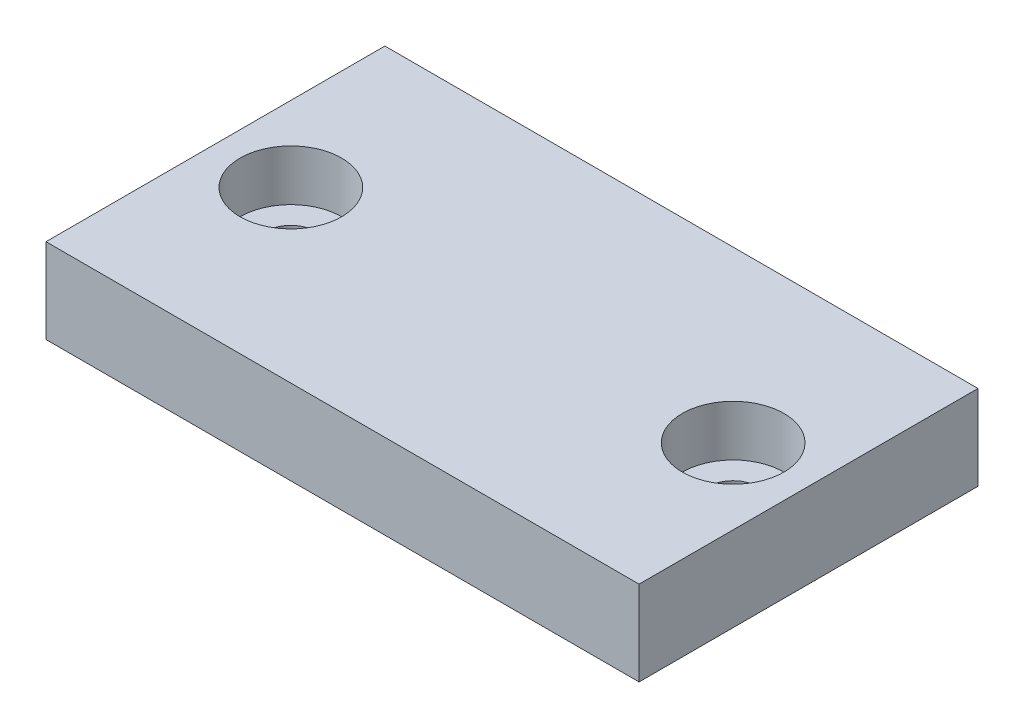
ISO-10303-21;
HEADER;
FILE_DESCRIPTION(('STEP AP214'),'2;1');
FILE_NAME('part.step','',(''),(''),'','','');
FILE_SCHEMA(('AUTOMOTIVE_DESIGN { 1 0 10303 214 1 1 1 1 }'));
ENDSEC;
DATA;
#1=APPLICATION_CONTEXT('core data for automotive mechanical design processes');
#2=APPLICATION_PROTOCOL_DEFINITION('international standard','automotive_design',2000,#1);
#3=PRODUCT_CONTEXT('',#1,'mechanical');
#4=PRODUCT('Part','Part','',(#3));
#5=PRODUCT_RELATED_PRODUCT_CATEGORY('part','',(#4));
#6=PRODUCT_DEFINITION_FORMATION('','',#4);
#7=PRODUCT_DEFINITION_CONTEXT('part definition',#1,'design');
#8=PRODUCT_DEFINITION('design','',#6,#7);
#9=PRODUCT_DEFINITION_SHAPE('','',#8);
#10=(LENGTH_UNIT() NAMED_UNIT(*) SI_UNIT(.MILLI.,.METRE.));
#11=(NAMED_UNIT(*) PLANE_ANGLE_UNIT() SI_UNIT($,.RADIAN.));
#12=(NAMED_UNIT(*) SI_UNIT($,.STERADIAN.) SOLID_ANGLE_UNIT());
#13=UNCERTAINTY_MEASURE_WITH_UNIT(LENGTH_MEASURE(1.E-05),#10,'distance_accuracy_value','');
#14=(GEOMETRIC_REPRESENTATION_CONTEXT(3) GLOBAL_UNCERTAINTY_ASSIGNED_CONTEXT((#13)) GLOBAL_UNIT_ASSIGNED_CONTEXT((#10,
#11,#12)) REPRESENTATION_CONTEXT('',''));
#15=CARTESIAN_POINT('',(0.,0.,0.));
#16=DIRECTION('',(0.,0.,1.));
#17=DIRECTION('',(1.,0.,0.));
#18=AXIS2_PLACEMENT_3D('',#15,#16,#17);
#19=CARTESIAN_POINT('',(-13.05,5.,0.));
#20=DIRECTION('',(0.,-1.,0.));
#21=DIRECTION('',(0.,0.,-1.));
#22=AXIS2_PLACEMENT_3D('',#19,#20,#21);
#23=CYLINDRICAL_SURFACE('',#22,1.5);
#24=CARTESIAN_POINT('',(-13.05,0.,0.));
#25=DIRECTION('',(0.,1.,0.));
#26=DIRECTION('',(0.,0.,1.));
#27=AXIS2_PLACEMENT_3D('',#24,#25,#26);
#28=CIRCLE('',#27,1.5);
#29=CARTESIAN_POINT('',(-13.05,0.,1.5));
#30=VERTEX_POINT('',#29);
#31=EDGE_CURVE('E103',#30,#30,#28,.T.);
#32=ORIENTED_EDGE('',*,*,#31,.F.);
#33=EDGE_LOOP('',(#32));
#34=FACE_BOUND('',#33,.T.);
#35=CARTESIAN_POINT('',(-13.05,2.,0.));
#36=DIRECTION('',(0.,1.,0.));
#37=DIRECTION('',(0.,0.,1.));
#38=AXIS2_PLACEMENT_3D('',#35,#36,#37);
#39=CIRCLE('',#38,1.5);
#40=CARTESIAN_POINT('',(-13.05,2.,1.5));
#41=VERTEX_POINT('',#40);
#42=EDGE_CURVE('E37',#41,#41,#39,.T.);
#43=ORIENTED_EDGE('',*,*,#42,.T.);
#44=EDGE_LOOP('',(#43));
#45=FACE_BOUND('',#44,.T.);
#46=ADVANCED_FACE('F33',(#34,#45),#23,.F.);
#47=CARTESIAN_POINT('',(13.05,5.,0.));
#48=DIRECTION('',(0.,-1.,0.));
#49=DIRECTION('',(0.,0.,-1.));
#50=AXIS2_PLACEMENT_3D('',#47,#48,#49);
#51=CYLINDRICAL_SURFACE('',#50,1.5);
#52=CARTESIAN_POINT('',(13.05,0.,0.));
#53=DIRECTION('',(0.,1.,0.));
#54=DIRECTION('',(0.,0.,1.));
#55=AXIS2_PLACEMENT_3D('',#52,#53,#54);
#56=CIRCLE('',#55,1.5);
#57=CARTESIAN_POINT('',(13.05,0.,1.49999999999999));
#58=VERTEX_POINT('',#57);
#59=EDGE_CURVE('E114',#58,#58,#56,.T.);
#60=ORIENTED_EDGE('',*,*,#59,.F.);
#61=EDGE_LOOP('',(#60));
#62=FACE_BOUND('',#61,.T.);
#63=CARTESIAN_POINT('',(13.05,2.,0.));
#64=DIRECTION('',(0.,1.,0.));
#65=DIRECTION('',(0.,0.,1.));
#66=AXIS2_PLACEMENT_3D('',#63,#64,#65);
#67=CIRCLE('',#66,1.5);
#68=CARTESIAN_POINT('',(13.05,2.,1.49999999999999));
#69=VERTEX_POINT('',#68);
#70=EDGE_CURVE('E108',#69,#69,#67,.T.);
#71=ORIENTED_EDGE('',*,*,#70,.T.);
#72=EDGE_LOOP('',(#71));
#73=FACE_BOUND('',#72,.T.);
#74=ADVANCED_FACE('F139',(#62,#73),#51,.F.);
#75=CARTESIAN_POINT('',(0.,5.,0.));
#76=DIRECTION('',(0.,1.,0.));
#77=DIRECTION('',(0.,0.,1.));
#78=AXIS2_PLACEMENT_3D('',#75,#76,#77);
#79=PLANE('',#78);
#80=CARTESIAN_POINT('',(-13.05,5.,0.));
#81=DIRECTION('',(0.,1.,0.));
#82=DIRECTION('',(0.,0.,1.));
#83=AXIS2_PLACEMENT_3D('',#80,#81,#82);
#84=CIRCLE('',#83,3.);
#85=CARTESIAN_POINT('',(-13.05,5.,3.));
#86=VERTEX_POINT('',#85);
#87=EDGE_CURVE('E116',#86,#86,#84,.T.);
#88=ORIENTED_EDGE('',*,*,#87,.F.);
#89=EDGE_LOOP('',(#88));
#90=FACE_BOUND('',#89,.T.);
#91=CARTESIAN_POINT('',(13.05,5.,0.));
#92=DIRECTION('',(0.,1.,0.));
#93=DIRECTION('',(0.,0.,1.));
#94=AXIS2_PLACEMENT_3D('',#91,#92,#93);
#95=CIRCLE('',#94,3.);
#96=CARTESIAN_POINT('',(13.05,5.,2.99999999999999));
#97=VERTEX_POINT('',#96);
#98=EDGE_CURVE('E126',#97,#97,#95,.T.);
#99=ORIENTED_EDGE('',*,*,#98,.F.);
#100=EDGE_LOOP('',(#99));
#101=FACE_BOUND('',#100,.T.);
#102=DIRECTION('',(0.,0.,1.));
#103=VECTOR('',#102,1.);
#104=CARTESIAN_POINT('',(-17.5,5.,10.));
#105=LINE('',#104,#103);
#106=CARTESIAN_POINT('',(-17.5,5.,-10.));
#107=VERTEX_POINT('',#106);
#108=CARTESIAN_POINT('',(-17.5,5.,10.));
#109=VERTEX_POINT('',#108);
#110=EDGE_CURVE('E87',#107,#109,#105,.T.);
#111=ORIENTED_EDGE('',*,*,#110,.T.);
#112=DIRECTION('',(1.,0.,0.));
#113=VECTOR('',#112,1.);
#114=CARTESIAN_POINT('',(17.5,5.,9.99999999999999));
#115=LINE('',#114,#113);
#116=CARTESIAN_POINT('',(17.5,5.,9.99999999999999));
#117=VERTEX_POINT('',#116);
#118=EDGE_CURVE('E82',#109,#117,#115,.T.);
#119=ORIENTED_EDGE('',*,*,#118,.T.);
#120=DIRECTION('',(0.,0.,-1.));
#121=VECTOR('',#120,1.);
#122=CARTESIAN_POINT('',(17.5,5.,9.99999999999999));
#123=LINE('',#122,#121);
#124=CARTESIAN_POINT('',(17.5,5.,-10.));
#125=VERTEX_POINT('',#124);
#126=EDGE_CURVE('E85',#117,#125,#123,.T.);
#127=ORIENTED_EDGE('',*,*,#126,.T.);
#128=DIRECTION('',(-1.,0.,0.));
#129=VECTOR('',#128,1.);
#130=CARTESIAN_POINT('',(17.5,5.,-10.));
#131=LINE('',#130,#129);
#132=EDGE_CURVE('E52',#125,#107,#131,.T.);
#133=ORIENTED_EDGE('',*,*,#132,.T.);
#134=EDGE_LOOP('',(#111,#119,#127,#133));
#135=FACE_BOUND('',#134,.T.);
#136=ADVANCED_FACE('F83',(#90,#101,#135),#79,.T.);
#137=CARTESIAN_POINT('',(0.,0.,0.));
#138=DIRECTION('',(0.,1.,0.));
#139=DIRECTION('',(0.,0.,1.));
#140=AXIS2_PLACEMENT_3D('',#137,#138,#139);
#141=PLANE('',#140);
#142=DIRECTION('',(0.,0.,1.));
#143=VECTOR('',#142,1.);
#144=CARTESIAN_POINT('',(-17.5,0.,10.));
#145=LINE('',#144,#143);
#146=CARTESIAN_POINT('',(-17.5,0.,-10.));
#147=VERTEX_POINT('',#146);
#148=CARTESIAN_POINT('',(-17.5,0.,10.));
#149=VERTEX_POINT('',#148);
#150=EDGE_CURVE('E100',#147,#149,#145,.T.);
#151=ORIENTED_EDGE('',*,*,#150,.F.);
#152=DIRECTION('',(-1.,0.,0.));
#153=VECTOR('',#152,1.);
#154=CARTESIAN_POINT('',(17.5,0.,-10.));
#155=LINE('',#154,#153);
#156=CARTESIAN_POINT('',(17.5,0.,-10.));
#157=VERTEX_POINT('',#156);
#158=EDGE_CURVE('E75',#157,#147,#155,.T.);
#159=ORIENTED_EDGE('',*,*,#158,.F.);
#160=DIRECTION('',(0.,0.,-1.));
#161=VECTOR('',#160,1.);
#162=CARTESIAN_POINT('',(17.5,0.,9.99999999999999));
#163=LINE('',#162,#161);
#164=CARTESIAN_POINT('',(17.5,0.,9.99999999999999));
#165=VERTEX_POINT('',#164);
#166=EDGE_CURVE('E69',#165,#157,#163,.T.);
#167=ORIENTED_EDGE('',*,*,#166,.F.);
#168=DIRECTION('',(1.,0.,0.));
#169=VECTOR('',#168,1.);
#170=CARTESIAN_POINT('',(17.5,0.,9.99999999999999));
#171=LINE('',#170,#169);
#172=EDGE_CURVE('E91',#149,#165,#171,.T.);
#173=ORIENTED_EDGE('',*,*,#172,.F.);
#174=EDGE_LOOP('',(#151,#159,#167,#173));
#175=FACE_BOUND('',#174,.T.);
#176=ORIENTED_EDGE('',*,*,#31,.T.);
#177=EDGE_LOOP('',(#176));
#178=FACE_BOUND('',#177,.T.);
#179=ORIENTED_EDGE('',*,*,#59,.T.);
#180=EDGE_LOOP('',(#179));
#181=FACE_BOUND('',#180,.T.);
#182=ADVANCED_FACE('F134',(#175,#178,#181),#141,.F.);
#183=CARTESIAN_POINT('',(-17.5,5.,10.));
#184=DIRECTION('',(1.,0.,0.));
#185=DIRECTION('',(0.,0.,-1.));
#186=AXIS2_PLACEMENT_3D('',#183,#184,#185);
#187=PLANE('',#186);
#188=ORIENTED_EDGE('',*,*,#150,.T.);
#189=DIRECTION('',(0.,-1.,0.));
#190=VECTOR('',#189,1.);
#191=CARTESIAN_POINT('',(-17.5,5.,10.));
#192=LINE('',#191,#190);
#193=EDGE_CURVE('E11',#109,#149,#192,.T.);
#194=ORIENTED_EDGE('',*,*,#193,.F.);
#195=ORIENTED_EDGE('',*,*,#110,.F.);
#196=DIRECTION('',(0.,-1.,0.));
#197=VECTOR('',#196,1.);
#198=CARTESIAN_POINT('',(-17.5,5.,-10.));
#199=LINE('',#198,#197);
#200=EDGE_CURVE('E96',#107,#147,#199,.T.);
#201=ORIENTED_EDGE('',*,*,#200,.T.);
#202=EDGE_LOOP('',(#188,#194,#195,#201));
#203=FACE_BOUND('',#202,.T.);
#204=ADVANCED_FACE('F35',(#203),#187,.F.);
#205=CARTESIAN_POINT('',(17.5,5.,9.99999999999999));
#206=DIRECTION('',(0.,0.,-1.));
#207=DIRECTION('',(-1.,0.,0.));
#208=AXIS2_PLACEMENT_3D('',#205,#206,#207);
#209=PLANE('',#208);
#210=ORIENTED_EDGE('',*,*,#172,.T.);
#211=DIRECTION('',(0.,-1.,0.));
#212=VECTOR('',#211,1.);
#213=CARTESIAN_POINT('',(17.5,5.,9.99999999999999));
#214=LINE('',#213,#212);
#215=EDGE_CURVE('E43',#117,#165,#214,.T.);
#216=ORIENTED_EDGE('',*,*,#215,.F.);
#217=ORIENTED_EDGE('',*,*,#118,.F.);
#218=ORIENTED_EDGE('',*,*,#193,.T.);
#219=EDGE_LOOP('',(#210,#216,#217,#218));
#220=FACE_BOUND('',#219,.T.);
#221=ADVANCED_FACE('F90',(#220),#209,.F.);
#222=CARTESIAN_POINT('',(17.5,5.,9.99999999999999));
#223=DIRECTION('',(-1.,0.,0.));
#224=DIRECTION('',(0.,0.,1.));
#225=AXIS2_PLACEMENT_3D('',#222,#223,#224);
#226=PLANE('',#225);
#227=ORIENTED_EDGE('',*,*,#166,.T.);
#228=DIRECTION('',(0.,-1.,0.));
#229=VECTOR('',#228,1.);
#230=CARTESIAN_POINT('',(17.5,5.,-10.));
#231=LINE('',#230,#229);
#232=EDGE_CURVE('E92',#125,#157,#231,.T.);
#233=ORIENTED_EDGE('',*,*,#232,.F.);
#234=ORIENTED_EDGE('',*,*,#126,.F.);
#235=ORIENTED_EDGE('',*,*,#215,.T.);
#236=EDGE_LOOP('',(#227,#233,#234,#235));
#237=FACE_BOUND('',#236,.T.);
#238=ADVANCED_FACE('F94',(#237),#226,.F.);
#239=CARTESIAN_POINT('',(17.5,5.,-10.));
#240=DIRECTION('',(0.,0.,1.));
#241=DIRECTION('',(1.,0.,0.));
#242=AXIS2_PLACEMENT_3D('',#239,#240,#241);
#243=PLANE('',#242);
#244=ORIENTED_EDGE('',*,*,#158,.T.);
#245=ORIENTED_EDGE('',*,*,#200,.F.);
#246=ORIENTED_EDGE('',*,*,#132,.F.);
#247=ORIENTED_EDGE('',*,*,#232,.T.);
#248=EDGE_LOOP('',(#244,#245,#246,#247));
#249=FACE_BOUND('',#248,.T.);
#250=ADVANCED_FACE('F160',(#249),#243,.F.);
#251=CARTESIAN_POINT('',(13.05,2.,0.));
#252=DIRECTION('',(0.,1.,0.));
#253=DIRECTION('',(0.,0.,1.));
#254=AXIS2_PLACEMENT_3D('',#251,#252,#253);
#255=CYLINDRICAL_SURFACE('',#254,3.);
#256=CARTESIAN_POINT('',(13.05,2.,0.));
#257=DIRECTION('',(0.,1.,0.));
#258=DIRECTION('',(0.,0.,1.));
#259=AXIS2_PLACEMENT_3D('',#256,#257,#258);
#260=CIRCLE('',#259,3.);
#261=CARTESIAN_POINT('',(13.05,2.,2.99999999999999));
#262=VERTEX_POINT('',#261);
#263=EDGE_CURVE('E121',#262,#262,#260,.T.);
#264=ORIENTED_EDGE('',*,*,#263,.F.);
#265=EDGE_LOOP('',(#264));
#266=FACE_BOUND('',#265,.T.);
#267=ORIENTED_EDGE('',*,*,#98,.T.);
#268=EDGE_LOOP('',(#267));
#269=FACE_BOUND('',#268,.T.);
#270=ADVANCED_FACE('F156',(#266,#269),#255,.F.);
#271=CARTESIAN_POINT('',(13.05,2.,0.));
#272=DIRECTION('',(0.,1.,0.));
#273=DIRECTION('',(0.,0.,1.));
#274=AXIS2_PLACEMENT_3D('',#271,#272,#273);
#275=PLANE('',#274);
#276=ORIENTED_EDGE('',*,*,#70,.F.);
#277=EDGE_LOOP('',(#276));
#278=FACE_BOUND('',#277,.T.);
#279=ORIENTED_EDGE('',*,*,#263,.T.);
#280=EDGE_LOOP('',(#279));
#281=FACE_BOUND('',#280,.T.);
#282=ADVANCED_FACE('F150',(#278,#281),#275,.T.);
#283=CARTESIAN_POINT('',(-13.05,2.,0.));
#284=DIRECTION('',(0.,1.,0.));
#285=DIRECTION('',(0.,0.,1.));
#286=AXIS2_PLACEMENT_3D('',#283,#284,#285);
#287=CYLINDRICAL_SURFACE('',#286,3.);
#288=CARTESIAN_POINT('',(-13.05,2.,0.));
#289=DIRECTION('',(0.,1.,0.));
#290=DIRECTION('',(0.,0.,1.));
#291=AXIS2_PLACEMENT_3D('',#288,#289,#290);
#292=CIRCLE('',#291,3.);
#293=CARTESIAN_POINT('',(-13.05,2.,3.));
#294=VERTEX_POINT('',#293);
#295=EDGE_CURVE('E110',#294,#294,#292,.T.);
#296=ORIENTED_EDGE('',*,*,#295,.F.);
#297=EDGE_LOOP('',(#296));
#298=FACE_BOUND('',#297,.T.);
#299=ORIENTED_EDGE('',*,*,#87,.T.);
#300=EDGE_LOOP('',(#299));
#301=FACE_BOUND('',#300,.T.);
#302=ADVANCED_FACE('F145',(#298,#301),#287,.F.);
#303=CARTESIAN_POINT('',(-13.05,2.,0.));
#304=DIRECTION('',(0.,1.,0.));
#305=DIRECTION('',(0.,0.,1.));
#306=AXIS2_PLACEMENT_3D('',#303,#304,#305);
#307=PLANE('',#306);
#308=ORIENTED_EDGE('',*,*,#42,.F.);
#309=EDGE_LOOP('',(#308));
#310=FACE_BOUND('',#309,.T.);
#311=ORIENTED_EDGE('',*,*,#295,.T.);
#312=EDGE_LOOP('',(#311));
#313=FACE_BOUND('',#312,.T.);
#314=ADVANCED_FACE('F143',(#310,#313),#307,.T.);
#315=CLOSED_SHELL('',(#46,#74,#136,#182,#204,#221,#238,#250,#270,#282,#302,#314));
#316=MANIFOLD_SOLID_BREP('B2',#315);
#317=ADVANCED_BREP_SHAPE_REPRESENTATION('',(#18,#316),#14);
#318=SHAPE_DEFINITION_REPRESENTATION(#9,#317);
ENDSEC;
END-ISO-10303-21;
